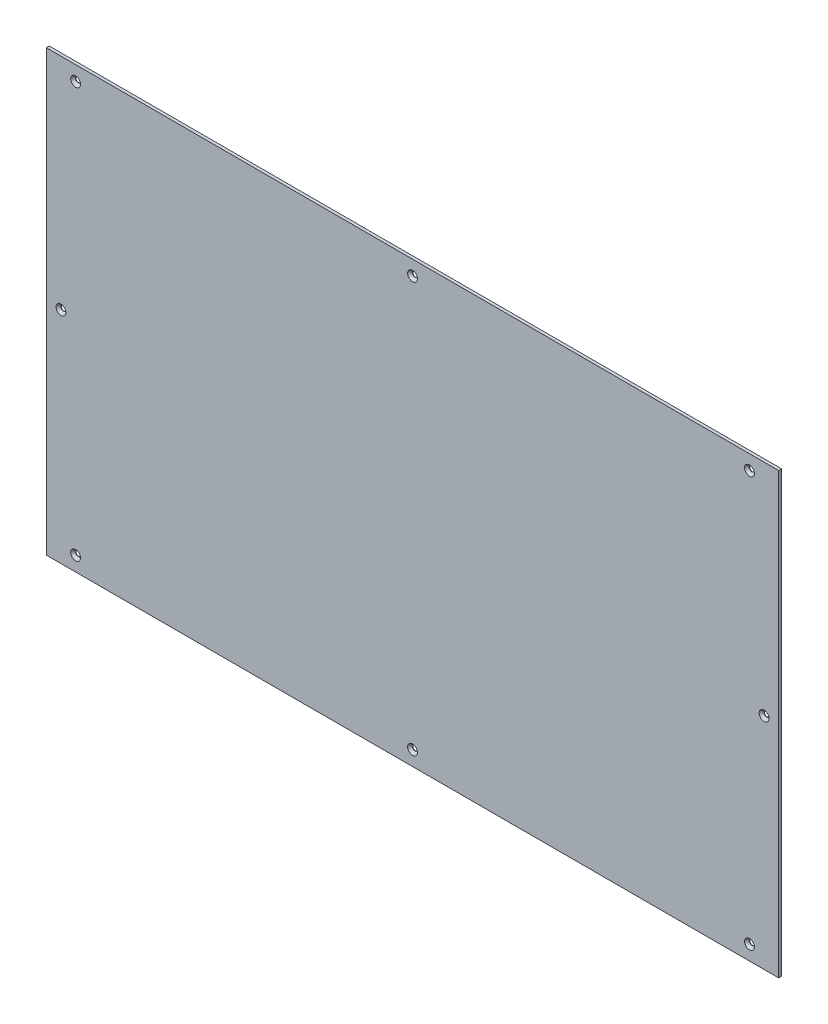
ISO-10303-21;
HEADER;
FILE_DESCRIPTION(('STEP AP214'),'2;1');
FILE_NAME('part.step','',(''),(''),'','','');
FILE_SCHEMA(('AUTOMOTIVE_DESIGN { 1 0 10303 214 1 1 1 1 }'));
ENDSEC;
DATA;
#1=APPLICATION_CONTEXT('core data for automotive mechanical design processes');
#2=APPLICATION_PROTOCOL_DEFINITION('international standard','automotive_design',2000,#1);
#3=PRODUCT_CONTEXT('',#1,'mechanical');
#4=PRODUCT('Part','Part','',(#3));
#5=PRODUCT_RELATED_PRODUCT_CATEGORY('part','',(#4));
#6=PRODUCT_DEFINITION_FORMATION('','',#4);
#7=PRODUCT_DEFINITION_CONTEXT('part definition',#1,'design');
#8=PRODUCT_DEFINITION('design','',#6,#7);
#9=PRODUCT_DEFINITION_SHAPE('','',#8);
#10=(LENGTH_UNIT() NAMED_UNIT(*) SI_UNIT(.MILLI.,.METRE.));
#11=(NAMED_UNIT(*) PLANE_ANGLE_UNIT() SI_UNIT($,.RADIAN.));
#12=(NAMED_UNIT(*) SI_UNIT($,.STERADIAN.) SOLID_ANGLE_UNIT());
#13=UNCERTAINTY_MEASURE_WITH_UNIT(LENGTH_MEASURE(1.E-05),#10,'distance_accuracy_value','');
#14=(GEOMETRIC_REPRESENTATION_CONTEXT(3) GLOBAL_UNCERTAINTY_ASSIGNED_CONTEXT((#13)) GLOBAL_UNIT_ASSIGNED_CONTEXT((#10,
#11,#12)) REPRESENTATION_CONTEXT('',''));
#15=CARTESIAN_POINT('',(0.,0.,0.));
#16=DIRECTION('',(0.,0.,1.));
#17=DIRECTION('',(1.,0.,0.));
#18=AXIS2_PLACEMENT_3D('',#15,#16,#17);
#19=CARTESIAN_POINT('',(0.,0.,4.));
#20=DIRECTION('',(0.,0.,-1.));
#21=DIRECTION('',(-1.,0.,0.));
#22=AXIS2_PLACEMENT_3D('',#19,#20,#21);
#23=PLANE('',#22);
#24=CARTESIAN_POINT('',(-480.,0.,4.));
#25=DIRECTION('',(0.,0.,1.));
#26=DIRECTION('',(1.,0.,0.));
#27=AXIS2_PLACEMENT_3D('',#24,#25,#26);
#28=CIRCLE('',#27,6.72);
#29=CARTESIAN_POINT('',(-473.28,0.,4.));
#30=VERTEX_POINT('',#29);
#31=EDGE_CURVE('E187',#30,#30,#28,.T.);
#32=ORIENTED_EDGE('',*,*,#31,.F.);
#33=EDGE_LOOP('',(#32));
#34=FACE_BOUND('',#33,.T.);
#35=CARTESIAN_POINT('',(480.,0.,4.));
#36=DIRECTION('',(0.,0.,1.));
#37=DIRECTION('',(1.,0.,0.));
#38=AXIS2_PLACEMENT_3D('',#35,#36,#37);
#39=CIRCLE('',#38,6.72);
#40=CARTESIAN_POINT('',(486.72,0.,4.));
#41=VERTEX_POINT('',#40);
#42=EDGE_CURVE('E179',#41,#41,#39,.T.);
#43=ORIENTED_EDGE('',*,*,#42,.F.);
#44=EDGE_LOOP('',(#43));
#45=FACE_BOUND('',#44,.T.);
#46=CARTESIAN_POINT('',(-460.,-280.,4.));
#47=DIRECTION('',(0.,0.,1.));
#48=DIRECTION('',(1.,0.,0.));
#49=AXIS2_PLACEMENT_3D('',#46,#47,#48);
#50=CIRCLE('',#49,6.72);
#51=CARTESIAN_POINT('',(-453.28,-280.,4.));
#52=VERTEX_POINT('',#51);
#53=EDGE_CURVE('E169',#52,#52,#50,.T.);
#54=ORIENTED_EDGE('',*,*,#53,.F.);
#55=EDGE_LOOP('',(#54));
#56=FACE_BOUND('',#55,.T.);
#57=CARTESIAN_POINT('',(0.,-280.,4.));
#58=DIRECTION('',(0.,0.,1.));
#59=DIRECTION('',(1.,0.,0.));
#60=AXIS2_PLACEMENT_3D('',#57,#58,#59);
#61=CIRCLE('',#60,6.72);
#62=CARTESIAN_POINT('',(6.72000000000004,-280.,4.));
#63=VERTEX_POINT('',#62);
#64=EDGE_CURVE('E157',#63,#63,#61,.T.);
#65=ORIENTED_EDGE('',*,*,#64,.F.);
#66=EDGE_LOOP('',(#65));
#67=FACE_BOUND('',#66,.T.);
#68=CARTESIAN_POINT('',(460.,-280.,4.));
#69=DIRECTION('',(0.,0.,1.));
#70=DIRECTION('',(1.,0.,0.));
#71=AXIS2_PLACEMENT_3D('',#68,#69,#70);
#72=CIRCLE('',#71,6.72);
#73=CARTESIAN_POINT('',(466.72,-280.,4.));
#74=VERTEX_POINT('',#73);
#75=EDGE_CURVE('E147',#74,#74,#72,.T.);
#76=ORIENTED_EDGE('',*,*,#75,.F.);
#77=EDGE_LOOP('',(#76));
#78=FACE_BOUND('',#77,.T.);
#79=CARTESIAN_POINT('',(460.,280.,4.));
#80=DIRECTION('',(0.,0.,1.));
#81=DIRECTION('',(1.,0.,0.));
#82=AXIS2_PLACEMENT_3D('',#79,#80,#81);
#83=CIRCLE('',#82,6.72);
#84=CARTESIAN_POINT('',(466.72,280.,4.));
#85=VERTEX_POINT('',#84);
#86=EDGE_CURVE('E143',#85,#85,#83,.T.);
#87=ORIENTED_EDGE('',*,*,#86,.F.);
#88=EDGE_LOOP('',(#87));
#89=FACE_BOUND('',#88,.T.);
#90=CARTESIAN_POINT('',(0.,280.,4.));
#91=DIRECTION('',(0.,0.,1.));
#92=DIRECTION('',(1.,0.,0.));
#93=AXIS2_PLACEMENT_3D('',#90,#91,#92);
#94=CIRCLE('',#93,6.72);
#95=CARTESIAN_POINT('',(6.71999999999997,280.,4.));
#96=VERTEX_POINT('',#95);
#97=EDGE_CURVE('E134',#96,#96,#94,.T.);
#98=ORIENTED_EDGE('',*,*,#97,.F.);
#99=EDGE_LOOP('',(#98));
#100=FACE_BOUND('',#99,.T.);
#101=DIRECTION('',(0.,1.,0.));
#102=VECTOR('',#101,1.);
#103=CARTESIAN_POINT('',(500.,-300.,4.));
#104=LINE('',#103,#102);
#105=CARTESIAN_POINT('',(500.,-300.,4.));
#106=VERTEX_POINT('',#105);
#107=CARTESIAN_POINT('',(500.,300.,4.));
#108=VERTEX_POINT('',#107);
#109=EDGE_CURVE('E93',#106,#108,#104,.T.);
#110=ORIENTED_EDGE('',*,*,#109,.T.);
#111=DIRECTION('',(-1.,0.,0.));
#112=VECTOR('',#111,1.);
#113=CARTESIAN_POINT('',(-500.,300.,4.));
#114=LINE('',#113,#112);
#115=CARTESIAN_POINT('',(-500.,300.,4.));
#116=VERTEX_POINT('',#115);
#117=EDGE_CURVE('E88',#108,#116,#114,.T.);
#118=ORIENTED_EDGE('',*,*,#117,.T.);
#119=DIRECTION('',(0.,-1.,0.));
#120=VECTOR('',#119,1.);
#121=CARTESIAN_POINT('',(-500.,-300.,4.));
#122=LINE('',#121,#120);
#123=CARTESIAN_POINT('',(-500.,-300.,4.));
#124=VERTEX_POINT('',#123);
#125=EDGE_CURVE('E90',#116,#124,#122,.T.);
#126=ORIENTED_EDGE('',*,*,#125,.T.);
#127=DIRECTION('',(1.,0.,0.));
#128=VECTOR('',#127,1.);
#129=CARTESIAN_POINT('',(-500.,-300.,4.));
#130=LINE('',#129,#128);
#131=EDGE_CURVE('E57',#124,#106,#130,.T.);
#132=ORIENTED_EDGE('',*,*,#131,.T.);
#133=EDGE_LOOP('',(#110,#118,#126,#132));
#134=FACE_BOUND('',#133,.T.);
#135=CARTESIAN_POINT('',(-460.,280.,4.));
#136=DIRECTION('',(0.,0.,1.));
#137=DIRECTION('',(1.,0.,0.));
#138=AXIS2_PLACEMENT_3D('',#135,#136,#137);
#139=CIRCLE('',#138,6.72);
#140=CARTESIAN_POINT('',(-453.28,280.,4.));
#141=VERTEX_POINT('',#140);
#142=EDGE_CURVE('E125',#141,#141,#139,.T.);
#143=ORIENTED_EDGE('',*,*,#142,.F.);
#144=EDGE_LOOP('',(#143));
#145=FACE_BOUND('',#144,.T.);
#146=ADVANCED_FACE('F39',(#34,#45,#56,#67,#78,#89,#100,#134,#145),#23,.F.);
#147=CARTESIAN_POINT('',(0.,0.,0.));
#148=DIRECTION('',(0.,0.,-1.));
#149=DIRECTION('',(-1.,0.,0.));
#150=AXIS2_PLACEMENT_3D('',#147,#148,#149);
#151=PLANE('',#150);
#152=CARTESIAN_POINT('',(-480.,0.,0.));
#153=DIRECTION('',(0.,0.,1.));
#154=DIRECTION('',(1.,0.,0.));
#155=AXIS2_PLACEMENT_3D('',#152,#153,#154);
#156=CIRCLE('',#155,3.30000000000003);
#157=CARTESIAN_POINT('',(-476.7,0.,0.));
#158=VERTEX_POINT('',#157);
#159=EDGE_CURVE('E178',#158,#158,#156,.T.);
#160=ORIENTED_EDGE('',*,*,#159,.T.);
#161=EDGE_LOOP('',(#160));
#162=FACE_BOUND('',#161,.T.);
#163=CARTESIAN_POINT('',(480.,0.,0.));
#164=DIRECTION('',(0.,0.,1.));
#165=DIRECTION('',(1.,0.,0.));
#166=AXIS2_PLACEMENT_3D('',#163,#164,#165);
#167=CIRCLE('',#166,3.30000000000003);
#168=CARTESIAN_POINT('',(483.3,0.,0.));
#169=VERTEX_POINT('',#168);
#170=EDGE_CURVE('E172',#169,#169,#167,.T.);
#171=ORIENTED_EDGE('',*,*,#170,.T.);
#172=EDGE_LOOP('',(#171));
#173=FACE_BOUND('',#172,.T.);
#174=CARTESIAN_POINT('',(-460.,-280.,0.));
#175=DIRECTION('',(0.,0.,1.));
#176=DIRECTION('',(1.,0.,0.));
#177=AXIS2_PLACEMENT_3D('',#174,#175,#176);
#178=CIRCLE('',#177,3.30000000000003);
#179=CARTESIAN_POINT('',(-456.7,-280.,0.));
#180=VERTEX_POINT('',#179);
#181=EDGE_CURVE('E165',#180,#180,#178,.T.);
#182=ORIENTED_EDGE('',*,*,#181,.T.);
#183=EDGE_LOOP('',(#182));
#184=FACE_BOUND('',#183,.T.);
#185=CARTESIAN_POINT('',(0.,-280.,0.));
#186=DIRECTION('',(0.,0.,1.));
#187=DIRECTION('',(1.,0.,0.));
#188=AXIS2_PLACEMENT_3D('',#185,#186,#187);
#189=CIRCLE('',#188,3.3);
#190=CARTESIAN_POINT('',(3.30000000000003,-280.,0.));
#191=VERTEX_POINT('',#190);
#192=EDGE_CURVE('E153',#191,#191,#189,.T.);
#193=ORIENTED_EDGE('',*,*,#192,.T.);
#194=EDGE_LOOP('',(#193));
#195=FACE_BOUND('',#194,.T.);
#196=CARTESIAN_POINT('',(460.,-280.,0.));
#197=DIRECTION('',(0.,0.,1.));
#198=DIRECTION('',(1.,0.,0.));
#199=AXIS2_PLACEMENT_3D('',#196,#197,#198);
#200=CIRCLE('',#199,3.30000000000003);
#201=CARTESIAN_POINT('',(463.3,-280.,0.));
#202=VERTEX_POINT('',#201);
#203=EDGE_CURVE('E145',#202,#202,#200,.T.);
#204=ORIENTED_EDGE('',*,*,#203,.T.);
#205=EDGE_LOOP('',(#204));
#206=FACE_BOUND('',#205,.T.);
#207=CARTESIAN_POINT('',(460.,280.,0.));
#208=DIRECTION('',(0.,0.,1.));
#209=DIRECTION('',(1.,0.,0.));
#210=AXIS2_PLACEMENT_3D('',#207,#208,#209);
#211=CIRCLE('',#210,3.30000000000003);
#212=CARTESIAN_POINT('',(463.3,280.,0.));
#213=VERTEX_POINT('',#212);
#214=EDGE_CURVE('E133',#213,#213,#211,.T.);
#215=ORIENTED_EDGE('',*,*,#214,.T.);
#216=EDGE_LOOP('',(#215));
#217=FACE_BOUND('',#216,.T.);
#218=CARTESIAN_POINT('',(0.,280.,0.));
#219=DIRECTION('',(0.,0.,1.));
#220=DIRECTION('',(1.,0.,0.));
#221=AXIS2_PLACEMENT_3D('',#218,#219,#220);
#222=CIRCLE('',#221,3.3);
#223=CARTESIAN_POINT('',(3.29999999999997,280.,0.));
#224=VERTEX_POINT('',#223);
#225=EDGE_CURVE('E127',#224,#224,#222,.T.);
#226=ORIENTED_EDGE('',*,*,#225,.T.);
#227=EDGE_LOOP('',(#226));
#228=FACE_BOUND('',#227,.T.);
#229=DIRECTION('',(0.,1.,0.));
#230=VECTOR('',#229,1.);
#231=CARTESIAN_POINT('',(500.,-300.,0.));
#232=LINE('',#231,#230);
#233=CARTESIAN_POINT('',(500.,-300.,0.));
#234=VERTEX_POINT('',#233);
#235=CARTESIAN_POINT('',(500.,300.,0.));
#236=VERTEX_POINT('',#235);
#237=EDGE_CURVE('E103',#234,#236,#232,.T.);
#238=ORIENTED_EDGE('',*,*,#237,.F.);
#239=DIRECTION('',(1.,0.,0.));
#240=VECTOR('',#239,1.);
#241=CARTESIAN_POINT('',(-500.,-300.,0.));
#242=LINE('',#241,#240);
#243=CARTESIAN_POINT('',(-500.,-300.,0.));
#244=VERTEX_POINT('',#243);
#245=EDGE_CURVE('E76',#244,#234,#242,.T.);
#246=ORIENTED_EDGE('',*,*,#245,.F.);
#247=DIRECTION('',(0.,-1.,0.));
#248=VECTOR('',#247,1.);
#249=CARTESIAN_POINT('',(-500.,-300.,0.));
#250=LINE('',#249,#248);
#251=CARTESIAN_POINT('',(-500.,300.,0.));
#252=VERTEX_POINT('',#251);
#253=EDGE_CURVE('E71',#252,#244,#250,.T.);
#254=ORIENTED_EDGE('',*,*,#253,.F.);
#255=DIRECTION('',(-1.,0.,0.));
#256=VECTOR('',#255,1.);
#257=CARTESIAN_POINT('',(-500.,300.,0.));
#258=LINE('',#257,#256);
#259=EDGE_CURVE('E92',#236,#252,#258,.T.);
#260=ORIENTED_EDGE('',*,*,#259,.F.);
#261=EDGE_LOOP('',(#238,#246,#254,#260));
#262=FACE_BOUND('',#261,.T.);
#263=CARTESIAN_POINT('',(-460.,280.,0.));
#264=DIRECTION('',(0.,0.,1.));
#265=DIRECTION('',(1.,0.,0.));
#266=AXIS2_PLACEMENT_3D('',#263,#264,#265);
#267=CIRCLE('',#266,3.30000000000003);
#268=CARTESIAN_POINT('',(-456.7,280.,0.));
#269=VERTEX_POINT('',#268);
#270=EDGE_CURVE('E106',#269,#269,#267,.T.);
#271=ORIENTED_EDGE('',*,*,#270,.T.);
#272=EDGE_LOOP('',(#271));
#273=FACE_BOUND('',#272,.T.);
#274=ADVANCED_FACE('F111',(#162,#173,#184,#195,#206,#217,#228,#262,#273),#151,.T.);
#275=CARTESIAN_POINT('',(500.,-300.,4.));
#276=DIRECTION('',(-1.,0.,0.));
#277=DIRECTION('',(0.,0.,1.));
#278=AXIS2_PLACEMENT_3D('',#275,#276,#277);
#279=PLANE('',#278);
#280=ORIENTED_EDGE('',*,*,#237,.T.);
#281=DIRECTION('',(0.,0.,-1.));
#282=VECTOR('',#281,1.);
#283=CARTESIAN_POINT('',(500.,300.,4.));
#284=LINE('',#283,#282);
#285=EDGE_CURVE('E11',#108,#236,#284,.T.);
#286=ORIENTED_EDGE('',*,*,#285,.F.);
#287=ORIENTED_EDGE('',*,*,#109,.F.);
#288=DIRECTION('',(0.,0.,-1.));
#289=VECTOR('',#288,1.);
#290=CARTESIAN_POINT('',(500.,-300.,4.));
#291=LINE('',#290,#289);
#292=EDGE_CURVE('E97',#106,#234,#291,.T.);
#293=ORIENTED_EDGE('',*,*,#292,.T.);
#294=EDGE_LOOP('',(#280,#286,#287,#293));
#295=FACE_BOUND('',#294,.T.);
#296=ADVANCED_FACE('F41',(#295),#279,.F.);
#297=CARTESIAN_POINT('',(-500.,300.,4.));
#298=DIRECTION('',(0.,-1.,0.));
#299=DIRECTION('',(0.,0.,-1.));
#300=AXIS2_PLACEMENT_3D('',#297,#298,#299);
#301=PLANE('',#300);
#302=ORIENTED_EDGE('',*,*,#259,.T.);
#303=DIRECTION('',(0.,0.,-1.));
#304=VECTOR('',#303,1.);
#305=CARTESIAN_POINT('',(-500.,300.,4.));
#306=LINE('',#305,#304);
#307=EDGE_CURVE('E48',#116,#252,#306,.T.);
#308=ORIENTED_EDGE('',*,*,#307,.F.);
#309=ORIENTED_EDGE('',*,*,#117,.F.);
#310=ORIENTED_EDGE('',*,*,#285,.T.);
#311=EDGE_LOOP('',(#302,#308,#309,#310));
#312=FACE_BOUND('',#311,.T.);
#313=ADVANCED_FACE('F94',(#312),#301,.F.);
#314=CARTESIAN_POINT('',(-500.,-300.,4.));
#315=DIRECTION('',(1.,0.,0.));
#316=DIRECTION('',(0.,0.,-1.));
#317=AXIS2_PLACEMENT_3D('',#314,#315,#316);
#318=PLANE('',#317);
#319=ORIENTED_EDGE('',*,*,#253,.T.);
#320=DIRECTION('',(0.,0.,-1.));
#321=VECTOR('',#320,1.);
#322=CARTESIAN_POINT('',(-500.,-300.,4.));
#323=LINE('',#322,#321);
#324=EDGE_CURVE('E96',#124,#244,#323,.T.);
#325=ORIENTED_EDGE('',*,*,#324,.F.);
#326=ORIENTED_EDGE('',*,*,#125,.F.);
#327=ORIENTED_EDGE('',*,*,#307,.T.);
#328=EDGE_LOOP('',(#319,#325,#326,#327));
#329=FACE_BOUND('',#328,.T.);
#330=ADVANCED_FACE('F100',(#329),#318,.F.);
#331=CARTESIAN_POINT('',(-500.,-300.,4.));
#332=DIRECTION('',(0.,1.,0.));
#333=DIRECTION('',(0.,0.,1.));
#334=AXIS2_PLACEMENT_3D('',#331,#332,#333);
#335=PLANE('',#334);
#336=ORIENTED_EDGE('',*,*,#245,.T.);
#337=ORIENTED_EDGE('',*,*,#292,.F.);
#338=ORIENTED_EDGE('',*,*,#131,.F.);
#339=ORIENTED_EDGE('',*,*,#324,.T.);
#340=EDGE_LOOP('',(#336,#337,#338,#339));
#341=FACE_BOUND('',#340,.T.);
#342=ADVANCED_FACE('F112',(#341),#335,.F.);
#343=CARTESIAN_POINT('',(-460.,280.,4.));
#344=DIRECTION('',(0.,0.,1.));
#345=DIRECTION('',(1.,0.,0.));
#346=AXIS2_PLACEMENT_3D('',#343,#344,#345);
#347=CYLINDRICAL_SURFACE('',#346,3.3);
#348=ORIENTED_EDGE('',*,*,#270,.F.);
#349=EDGE_LOOP('',(#348));
#350=FACE_BOUND('',#349,.T.);
#351=CARTESIAN_POINT('',(-460.,280.,0.579999999999994));
#352=DIRECTION('',(0.,0.,1.));
#353=DIRECTION('',(1.,0.,0.));
#354=AXIS2_PLACEMENT_3D('',#351,#352,#353);
#355=CIRCLE('',#354,3.29999999999997);
#356=CARTESIAN_POINT('',(-456.7,280.,0.579999999999994));
#357=VERTEX_POINT('',#356);
#358=EDGE_CURVE('E118',#357,#357,#355,.T.);
#359=ORIENTED_EDGE('',*,*,#358,.T.);
#360=EDGE_LOOP('',(#359));
#361=FACE_BOUND('',#360,.T.);
#362=ADVANCED_FACE('F230',(#350,#361),#347,.F.);
#363=CARTESIAN_POINT('',(-460.,280.,4.));
#364=DIRECTION('',(0.,0.,1.));
#365=DIRECTION('',(1.,0.,0.));
#366=AXIS2_PLACEMENT_3D('',#363,#364,#365);
#367=CONICAL_SURFACE('',#366,6.72,0.785398163397452);
#368=ORIENTED_EDGE('',*,*,#358,.F.);
#369=EDGE_LOOP('',(#368));
#370=FACE_BOUND('',#369,.T.);
#371=ORIENTED_EDGE('',*,*,#142,.T.);
#372=EDGE_LOOP('',(#371));
#373=FACE_BOUND('',#372,.T.);
#374=ADVANCED_FACE('F219',(#370,#373),#367,.F.);
#375=CARTESIAN_POINT('',(0.,280.,4.));
#376=DIRECTION('',(0.,0.,1.));
#377=DIRECTION('',(1.,0.,0.));
#378=AXIS2_PLACEMENT_3D('',#375,#376,#377);
#379=CYLINDRICAL_SURFACE('',#378,3.3);
#380=ORIENTED_EDGE('',*,*,#225,.F.);
#381=EDGE_LOOP('',(#380));
#382=FACE_BOUND('',#381,.T.);
#383=CARTESIAN_POINT('',(0.,280.,0.579999999999994));
#384=DIRECTION('',(0.,0.,1.));
#385=DIRECTION('',(1.,0.,0.));
#386=AXIS2_PLACEMENT_3D('',#383,#384,#385);
#387=CIRCLE('',#386,3.3);
#388=CARTESIAN_POINT('',(3.29999999999996,280.,0.579999999999994));
#389=VERTEX_POINT('',#388);
#390=EDGE_CURVE('E129',#389,#389,#387,.T.);
#391=ORIENTED_EDGE('',*,*,#390,.T.);
#392=EDGE_LOOP('',(#391));
#393=FACE_BOUND('',#392,.T.);
#394=ADVANCED_FACE('F209',(#382,#393),#379,.F.);
#395=CARTESIAN_POINT('',(0.,280.,4.));
#396=DIRECTION('',(0.,0.,1.));
#397=DIRECTION('',(1.,0.,0.));
#398=AXIS2_PLACEMENT_3D('',#395,#396,#397);
#399=CONICAL_SURFACE('',#398,6.72,0.785398163397448);
#400=ORIENTED_EDGE('',*,*,#390,.F.);
#401=EDGE_LOOP('',(#400));
#402=FACE_BOUND('',#401,.T.);
#403=ORIENTED_EDGE('',*,*,#97,.T.);
#404=EDGE_LOOP('',(#403));
#405=FACE_BOUND('',#404,.T.);
#406=ADVANCED_FACE('F210',(#402,#405),#399,.F.);
#407=CARTESIAN_POINT('',(460.,280.,4.));
#408=DIRECTION('',(0.,0.,1.));
#409=DIRECTION('',(1.,0.,0.));
#410=AXIS2_PLACEMENT_3D('',#407,#408,#409);
#411=CYLINDRICAL_SURFACE('',#410,3.3);
#412=ORIENTED_EDGE('',*,*,#214,.F.);
#413=EDGE_LOOP('',(#412));
#414=FACE_BOUND('',#413,.T.);
#415=CARTESIAN_POINT('',(460.,280.,0.579999999999994));
#416=DIRECTION('',(0.,0.,1.));
#417=DIRECTION('',(1.,0.,0.));
#418=AXIS2_PLACEMENT_3D('',#415,#416,#417);
#419=CIRCLE('',#418,3.29999999999997);
#420=CARTESIAN_POINT('',(463.3,280.,0.579999999999994));
#421=VERTEX_POINT('',#420);
#422=EDGE_CURVE('E140',#421,#421,#419,.T.);
#423=ORIENTED_EDGE('',*,*,#422,.T.);
#424=EDGE_LOOP('',(#423));
#425=FACE_BOUND('',#424,.T.);
#426=ADVANCED_FACE('F207',(#414,#425),#411,.F.);
#427=CARTESIAN_POINT('',(460.,280.,4.));
#428=DIRECTION('',(0.,0.,1.));
#429=DIRECTION('',(1.,0.,0.));
#430=AXIS2_PLACEMENT_3D('',#427,#428,#429);
#431=CONICAL_SURFACE('',#430,6.72,0.785398163397452);
#432=ORIENTED_EDGE('',*,*,#422,.F.);
#433=EDGE_LOOP('',(#432));
#434=FACE_BOUND('',#433,.T.);
#435=ORIENTED_EDGE('',*,*,#86,.T.);
#436=EDGE_LOOP('',(#435));
#437=FACE_BOUND('',#436,.T.);
#438=ADVANCED_FACE('F220',(#434,#437),#431,.F.);
#439=CARTESIAN_POINT('',(460.,-280.,4.));
#440=DIRECTION('',(0.,0.,1.));
#441=DIRECTION('',(1.,0.,0.));
#442=AXIS2_PLACEMENT_3D('',#439,#440,#441);
#443=CYLINDRICAL_SURFACE('',#442,3.3);
#444=ORIENTED_EDGE('',*,*,#203,.F.);
#445=EDGE_LOOP('',(#444));
#446=FACE_BOUND('',#445,.T.);
#447=CARTESIAN_POINT('',(460.,-280.,0.579999999999994));
#448=DIRECTION('',(0.,0.,1.));
#449=DIRECTION('',(1.,0.,0.));
#450=AXIS2_PLACEMENT_3D('',#447,#448,#449);
#451=CIRCLE('',#450,3.29999999999997);
#452=CARTESIAN_POINT('',(463.3,-280.,0.579999999999994));
#453=VERTEX_POINT('',#452);
#454=EDGE_CURVE('E150',#453,#453,#451,.T.);
#455=ORIENTED_EDGE('',*,*,#454,.T.);
#456=EDGE_LOOP('',(#455));
#457=FACE_BOUND('',#456,.T.);
#458=ADVANCED_FACE('F310',(#446,#457),#443,.F.);
#459=CARTESIAN_POINT('',(460.,-280.,4.));
#460=DIRECTION('',(0.,0.,1.));
#461=DIRECTION('',(1.,0.,0.));
#462=AXIS2_PLACEMENT_3D('',#459,#460,#461);
#463=CONICAL_SURFACE('',#462,6.72,0.785398163397452);
#464=ORIENTED_EDGE('',*,*,#454,.F.);
#465=EDGE_LOOP('',(#464));
#466=FACE_BOUND('',#465,.T.);
#467=ORIENTED_EDGE('',*,*,#75,.T.);
#468=EDGE_LOOP('',(#467));
#469=FACE_BOUND('',#468,.T.);
#470=ADVANCED_FACE('F318',(#466,#469),#463,.F.);
#471=CARTESIAN_POINT('',(0.,-280.,4.));
#472=DIRECTION('',(0.,0.,1.));
#473=DIRECTION('',(1.,0.,0.));
#474=AXIS2_PLACEMENT_3D('',#471,#472,#473);
#475=CYLINDRICAL_SURFACE('',#474,3.3);
#476=ORIENTED_EDGE('',*,*,#192,.F.);
#477=EDGE_LOOP('',(#476));
#478=FACE_BOUND('',#477,.T.);
#479=CARTESIAN_POINT('',(0.,-280.,0.579999999999994));
#480=DIRECTION('',(0.,0.,1.));
#481=DIRECTION('',(1.,0.,0.));
#482=AXIS2_PLACEMENT_3D('',#479,#480,#481);
#483=CIRCLE('',#482,3.3);
#484=CARTESIAN_POINT('',(3.30000000000003,-280.,0.579999999999994));
#485=VERTEX_POINT('',#484);
#486=EDGE_CURVE('E156',#485,#485,#483,.T.);
#487=ORIENTED_EDGE('',*,*,#486,.T.);
#488=EDGE_LOOP('',(#487));
#489=FACE_BOUND('',#488,.T.);
#490=ADVANCED_FACE('F327',(#478,#489),#475,.F.);
#491=CARTESIAN_POINT('',(0.,-280.,4.));
#492=DIRECTION('',(0.,0.,1.));
#493=DIRECTION('',(1.,0.,0.));
#494=AXIS2_PLACEMENT_3D('',#491,#492,#493);
#495=CONICAL_SURFACE('',#494,6.72,0.785398163397448);
#496=ORIENTED_EDGE('',*,*,#486,.F.);
#497=EDGE_LOOP('',(#496));
#498=FACE_BOUND('',#497,.T.);
#499=ORIENTED_EDGE('',*,*,#64,.T.);
#500=EDGE_LOOP('',(#499));
#501=FACE_BOUND('',#500,.T.);
#502=ADVANCED_FACE('F340',(#498,#501),#495,.F.);
#503=CARTESIAN_POINT('',(-460.,-280.,4.));
#504=DIRECTION('',(0.,0.,1.));
#505=DIRECTION('',(1.,0.,0.));
#506=AXIS2_PLACEMENT_3D('',#503,#504,#505);
#507=CYLINDRICAL_SURFACE('',#506,3.3);
#508=ORIENTED_EDGE('',*,*,#181,.F.);
#509=EDGE_LOOP('',(#508));
#510=FACE_BOUND('',#509,.T.);
#511=CARTESIAN_POINT('',(-460.,-280.,0.579999999999994));
#512=DIRECTION('',(0.,0.,1.));
#513=DIRECTION('',(1.,0.,0.));
#514=AXIS2_PLACEMENT_3D('',#511,#512,#513);
#515=CIRCLE('',#514,3.29999999999997);
#516=CARTESIAN_POINT('',(-456.7,-280.,0.579999999999994));
#517=VERTEX_POINT('',#516);
#518=EDGE_CURVE('E164',#517,#517,#515,.T.);
#519=ORIENTED_EDGE('',*,*,#518,.T.);
#520=EDGE_LOOP('',(#519));
#521=FACE_BOUND('',#520,.T.);
#522=ADVANCED_FACE('F346',(#510,#521),#507,.F.);
#523=CARTESIAN_POINT('',(-460.,-280.,4.));
#524=DIRECTION('',(0.,0.,1.));
#525=DIRECTION('',(1.,0.,0.));
#526=AXIS2_PLACEMENT_3D('',#523,#524,#525);
#527=CONICAL_SURFACE('',#526,6.72,0.785398163397452);
#528=ORIENTED_EDGE('',*,*,#518,.F.);
#529=EDGE_LOOP('',(#528));
#530=FACE_BOUND('',#529,.T.);
#531=ORIENTED_EDGE('',*,*,#53,.T.);
#532=EDGE_LOOP('',(#531));
#533=FACE_BOUND('',#532,.T.);
#534=ADVANCED_FACE('F360',(#530,#533),#527,.F.);
#535=CARTESIAN_POINT('',(480.,0.,4.));
#536=DIRECTION('',(0.,0.,1.));
#537=DIRECTION('',(1.,0.,0.));
#538=AXIS2_PLACEMENT_3D('',#535,#536,#537);
#539=CYLINDRICAL_SURFACE('',#538,3.3);
#540=ORIENTED_EDGE('',*,*,#170,.F.);
#541=EDGE_LOOP('',(#540));
#542=FACE_BOUND('',#541,.T.);
#543=CARTESIAN_POINT('',(480.,0.,0.579999999999994));
#544=DIRECTION('',(0.,0.,1.));
#545=DIRECTION('',(1.,0.,0.));
#546=AXIS2_PLACEMENT_3D('',#543,#544,#545);
#547=CIRCLE('',#546,3.29999999999997);
#548=CARTESIAN_POINT('',(483.3,0.,0.579999999999994));
#549=VERTEX_POINT('',#548);
#550=EDGE_CURVE('E171',#549,#549,#547,.T.);
#551=ORIENTED_EDGE('',*,*,#550,.T.);
#552=EDGE_LOOP('',(#551));
#553=FACE_BOUND('',#552,.T.);
#554=ADVANCED_FACE('F366',(#542,#553),#539,.F.);
#555=CARTESIAN_POINT('',(480.,0.,4.));
#556=DIRECTION('',(0.,0.,1.));
#557=DIRECTION('',(1.,0.,0.));
#558=AXIS2_PLACEMENT_3D('',#555,#556,#557);
#559=CONICAL_SURFACE('',#558,6.72,0.785398163397452);
#560=ORIENTED_EDGE('',*,*,#550,.F.);
#561=EDGE_LOOP('',(#560));
#562=FACE_BOUND('',#561,.T.);
#563=ORIENTED_EDGE('',*,*,#42,.T.);
#564=EDGE_LOOP('',(#563));
#565=FACE_BOUND('',#564,.T.);
#566=ADVANCED_FACE('F378',(#562,#565),#559,.F.);
#567=CARTESIAN_POINT('',(-480.,0.,4.));
#568=DIRECTION('',(0.,0.,1.));
#569=DIRECTION('',(1.,0.,0.));
#570=AXIS2_PLACEMENT_3D('',#567,#568,#569);
#571=CYLINDRICAL_SURFACE('',#570,3.3);
#572=ORIENTED_EDGE('',*,*,#159,.F.);
#573=EDGE_LOOP('',(#572));
#574=FACE_BOUND('',#573,.T.);
#575=CARTESIAN_POINT('',(-480.,0.,0.579999999999994));
#576=DIRECTION('',(0.,0.,1.));
#577=DIRECTION('',(1.,0.,0.));
#578=AXIS2_PLACEMENT_3D('',#575,#576,#577);
#579=CIRCLE('',#578,3.29999999999997);
#580=CARTESIAN_POINT('',(-476.7,0.,0.579999999999994));
#581=VERTEX_POINT('',#580);
#582=EDGE_CURVE('E181',#581,#581,#579,.T.);
#583=ORIENTED_EDGE('',*,*,#582,.T.);
#584=EDGE_LOOP('',(#583));
#585=FACE_BOUND('',#584,.T.);
#586=ADVANCED_FACE('F389',(#574,#585),#571,.F.);
#587=CARTESIAN_POINT('',(-480.,0.,4.));
#588=DIRECTION('',(0.,0.,1.));
#589=DIRECTION('',(1.,0.,0.));
#590=AXIS2_PLACEMENT_3D('',#587,#588,#589);
#591=CONICAL_SURFACE('',#590,6.72,0.785398163397452);
#592=ORIENTED_EDGE('',*,*,#582,.F.);
#593=EDGE_LOOP('',(#592));
#594=FACE_BOUND('',#593,.T.);
#595=ORIENTED_EDGE('',*,*,#31,.T.);
#596=EDGE_LOOP('',(#595));
#597=FACE_BOUND('',#596,.T.);
#598=ADVANCED_FACE('F188',(#594,#597),#591,.F.);
#599=CLOSED_SHELL('',(#146,#274,#296,#313,#330,#342,#362,#374,#394,#406,#426,#438,#458,#470,
#490,#502,#522,#534,#554,#566,#586,#598));
#600=MANIFOLD_SOLID_BREP('B2',#599);
#601=ADVANCED_BREP_SHAPE_REPRESENTATION('',(#18,#600),#14);
#602=SHAPE_DEFINITION_REPRESENTATION(#9,#601);
ENDSEC;
END-ISO-10303-21;
